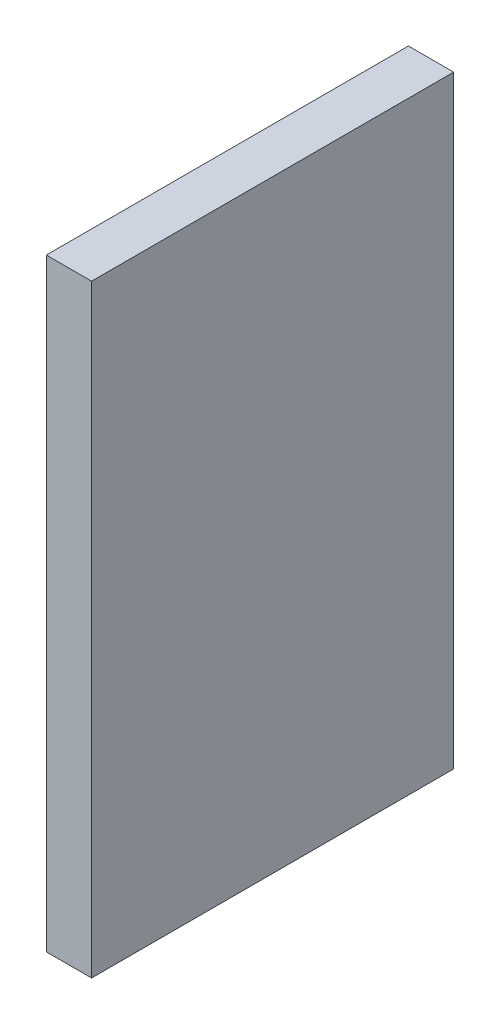
ISO-10303-21;
HEADER;
FILE_DESCRIPTION(('STEP AP214'),'2;1');
FILE_NAME('part.step','',(''),(''),'','','');
FILE_SCHEMA(('AUTOMOTIVE_DESIGN { 1 0 10303 214 1 1 1 1 }'));
ENDSEC;
DATA;
#1=APPLICATION_CONTEXT('core data for automotive mechanical design processes');
#2=APPLICATION_PROTOCOL_DEFINITION('international standard','automotive_design',2000,#1);
#3=PRODUCT_CONTEXT('',#1,'mechanical');
#4=PRODUCT('Part','Part','',(#3));
#5=PRODUCT_RELATED_PRODUCT_CATEGORY('part','',(#4));
#6=PRODUCT_DEFINITION_FORMATION('','',#4);
#7=PRODUCT_DEFINITION_CONTEXT('part definition',#1,'design');
#8=PRODUCT_DEFINITION('design','',#6,#7);
#9=PRODUCT_DEFINITION_SHAPE('','',#8);
#10=(LENGTH_UNIT() NAMED_UNIT(*) SI_UNIT(.MILLI.,.METRE.));
#11=(NAMED_UNIT(*) PLANE_ANGLE_UNIT() SI_UNIT($,.RADIAN.));
#12=(NAMED_UNIT(*) SI_UNIT($,.STERADIAN.) SOLID_ANGLE_UNIT());
#13=UNCERTAINTY_MEASURE_WITH_UNIT(LENGTH_MEASURE(1.E-05),#10,'distance_accuracy_value','');
#14=(GEOMETRIC_REPRESENTATION_CONTEXT(3) GLOBAL_UNCERTAINTY_ASSIGNED_CONTEXT((#13)) GLOBAL_UNIT_ASSIGNED_CONTEXT((#10,
#11,#12)) REPRESENTATION_CONTEXT('',''));
#15=CARTESIAN_POINT('',(0.,0.,0.));
#16=DIRECTION('',(0.,0.,1.));
#17=DIRECTION('',(1.,0.,0.));
#18=AXIS2_PLACEMENT_3D('',#15,#16,#17);
#19=CARTESIAN_POINT('',(15.,100.,-60.));
#20=DIRECTION('',(0.,-1.,0.));
#21=DIRECTION('',(0.,0.,-1.));
#22=AXIS2_PLACEMENT_3D('',#19,#20,#21);
#23=PLANE('',#22);
#24=DIRECTION('',(0.,0.,1.));
#25=VECTOR('',#24,1.);
#26=CARTESIAN_POINT('',(0.,100.,-60.));
#27=LINE('',#26,#25);
#28=CARTESIAN_POINT('',(0.,100.,-60.));
#29=VERTEX_POINT('',#28);
#30=CARTESIAN_POINT('',(0.,100.,60.));
#31=VERTEX_POINT('',#30);
#32=EDGE_CURVE('E102',#29,#31,#27,.T.);
#33=ORIENTED_EDGE('',*,*,#32,.T.);
#34=DIRECTION('',(-1.,0.,0.));
#35=VECTOR('',#34,1.);
#36=CARTESIAN_POINT('',(15.,100.,60.));
#37=LINE('',#36,#35);
#38=CARTESIAN_POINT('',(15.,100.,60.));
#39=VERTEX_POINT('',#38);
#40=EDGE_CURVE('E11',#39,#31,#37,.T.);
#41=ORIENTED_EDGE('',*,*,#40,.F.);
#42=DIRECTION('',(0.,0.,1.));
#43=VECTOR('',#42,1.);
#44=CARTESIAN_POINT('',(15.,100.,-60.));
#45=LINE('',#44,#43);
#46=CARTESIAN_POINT('',(15.,100.,-60.));
#47=VERTEX_POINT('',#46);
#48=EDGE_CURVE('E90',#47,#39,#45,.T.);
#49=ORIENTED_EDGE('',*,*,#48,.F.);
#50=DIRECTION('',(-1.,0.,0.));
#51=VECTOR('',#50,1.);
#52=CARTESIAN_POINT('',(15.,100.,-60.));
#53=LINE('',#52,#51);
#54=EDGE_CURVE('E98',#47,#29,#53,.T.);
#55=ORIENTED_EDGE('',*,*,#54,.T.);
#56=EDGE_LOOP('',(#33,#41,#49,#55));
#57=FACE_BOUND('',#56,.T.);
#58=ADVANCED_FACE('F39',(#57),#23,.F.);
#59=CARTESIAN_POINT('',(15.,-100.,60.));
#60=DIRECTION('',(0.,0.,-1.));
#61=DIRECTION('',(-1.,0.,0.));
#62=AXIS2_PLACEMENT_3D('',#59,#60,#61);
#63=PLANE('',#62);
#64=DIRECTION('',(0.,-1.,0.));
#65=VECTOR('',#64,1.);
#66=CARTESIAN_POINT('',(0.,-100.,60.));
#67=LINE('',#66,#65);
#68=CARTESIAN_POINT('',(0.,-100.,60.));
#69=VERTEX_POINT('',#68);
#70=EDGE_CURVE('E94',#31,#69,#67,.T.);
#71=ORIENTED_EDGE('',*,*,#70,.T.);
#72=DIRECTION('',(-1.,0.,0.));
#73=VECTOR('',#72,1.);
#74=CARTESIAN_POINT('',(15.,-100.,60.));
#75=LINE('',#74,#73);
#76=CARTESIAN_POINT('',(15.,-100.,60.));
#77=VERTEX_POINT('',#76);
#78=EDGE_CURVE('E47',#77,#69,#75,.T.);
#79=ORIENTED_EDGE('',*,*,#78,.F.);
#80=DIRECTION('',(0.,-1.,0.));
#81=VECTOR('',#80,1.);
#82=CARTESIAN_POINT('',(15.,-100.,60.));
#83=LINE('',#82,#81);
#84=EDGE_CURVE('E85',#39,#77,#83,.T.);
#85=ORIENTED_EDGE('',*,*,#84,.F.);
#86=ORIENTED_EDGE('',*,*,#40,.T.);
#87=EDGE_LOOP('',(#71,#79,#85,#86));
#88=FACE_BOUND('',#87,.T.);
#89=ADVANCED_FACE('F93',(#88),#63,.F.);
#90=CARTESIAN_POINT('',(15.,-100.,-60.));
#91=DIRECTION('',(0.,1.,0.));
#92=DIRECTION('',(0.,0.,1.));
#93=AXIS2_PLACEMENT_3D('',#90,#91,#92);
#94=PLANE('',#93);
#95=DIRECTION('',(0.,0.,-1.));
#96=VECTOR('',#95,1.);
#97=CARTESIAN_POINT('',(0.,-100.,-60.));
#98=LINE('',#97,#96);
#99=CARTESIAN_POINT('',(0.,-100.,-60.));
#100=VERTEX_POINT('',#99);
#101=EDGE_CURVE('E72',#69,#100,#98,.T.);
#102=ORIENTED_EDGE('',*,*,#101,.T.);
#103=DIRECTION('',(-1.,0.,0.));
#104=VECTOR('',#103,1.);
#105=CARTESIAN_POINT('',(15.,-100.,-60.));
#106=LINE('',#105,#104);
#107=CARTESIAN_POINT('',(15.,-100.,-60.));
#108=VERTEX_POINT('',#107);
#109=EDGE_CURVE('E95',#108,#100,#106,.T.);
#110=ORIENTED_EDGE('',*,*,#109,.F.);
#111=DIRECTION('',(0.,0.,-1.));
#112=VECTOR('',#111,1.);
#113=CARTESIAN_POINT('',(15.,-100.,-60.));
#114=LINE('',#113,#112);
#115=EDGE_CURVE('E88',#77,#108,#114,.T.);
#116=ORIENTED_EDGE('',*,*,#115,.F.);
#117=ORIENTED_EDGE('',*,*,#78,.T.);
#118=EDGE_LOOP('',(#102,#110,#116,#117));
#119=FACE_BOUND('',#118,.T.);
#120=ADVANCED_FACE('F96',(#119),#94,.F.);
#121=CARTESIAN_POINT('',(15.,-100.,-60.));
#122=DIRECTION('',(0.,0.,1.));
#123=DIRECTION('',(1.,0.,0.));
#124=AXIS2_PLACEMENT_3D('',#121,#122,#123);
#125=PLANE('',#124);
#126=DIRECTION('',(0.,1.,0.));
#127=VECTOR('',#126,1.);
#128=CARTESIAN_POINT('',(0.,-100.,-60.));
#129=LINE('',#128,#127);
#130=EDGE_CURVE('E78',#100,#29,#129,.T.);
#131=ORIENTED_EDGE('',*,*,#130,.T.);
#132=ORIENTED_EDGE('',*,*,#54,.F.);
#133=DIRECTION('',(0.,1.,0.));
#134=VECTOR('',#133,1.);
#135=CARTESIAN_POINT('',(15.,-100.,-60.));
#136=LINE('',#135,#134);
#137=EDGE_CURVE('E55',#108,#47,#136,.T.);
#138=ORIENTED_EDGE('',*,*,#137,.F.);
#139=ORIENTED_EDGE('',*,*,#109,.T.);
#140=EDGE_LOOP('',(#131,#132,#138,#139));
#141=FACE_BOUND('',#140,.T.);
#142=ADVANCED_FACE('F109',(#141),#125,.F.);
#143=CARTESIAN_POINT('',(15.,0.,0.));
#144=DIRECTION('',(-1.,0.,0.));
#145=DIRECTION('',(0.,0.,1.));
#146=AXIS2_PLACEMENT_3D('',#143,#144,#145);
#147=PLANE('',#146);
#148=ORIENTED_EDGE('',*,*,#48,.T.);
#149=ORIENTED_EDGE('',*,*,#84,.T.);
#150=ORIENTED_EDGE('',*,*,#115,.T.);
#151=ORIENTED_EDGE('',*,*,#137,.T.);
#152=EDGE_LOOP('',(#148,#149,#150,#151));
#153=FACE_BOUND('',#152,.T.);
#154=ADVANCED_FACE('F86',(#153),#147,.F.);
#155=CARTESIAN_POINT('',(0.,0.,0.));
#156=DIRECTION('',(-1.,0.,0.));
#157=DIRECTION('',(0.,0.,1.));
#158=AXIS2_PLACEMENT_3D('',#155,#156,#157);
#159=PLANE('',#158);
#160=ORIENTED_EDGE('',*,*,#32,.F.);
#161=ORIENTED_EDGE('',*,*,#130,.F.);
#162=ORIENTED_EDGE('',*,*,#101,.F.);
#163=ORIENTED_EDGE('',*,*,#70,.F.);
#164=EDGE_LOOP('',(#160,#161,#162,#163));
#165=FACE_BOUND('',#164,.T.);
#166=ADVANCED_FACE('F112',(#165),#159,.T.);
#167=CLOSED_SHELL('',(#58,#89,#120,#142,#154,#166));
#168=MANIFOLD_SOLID_BREP('B2',#167);
#169=ADVANCED_BREP_SHAPE_REPRESENTATION('',(#18,#168),#14);
#170=SHAPE_DEFINITION_REPRESENTATION(#9,#169);
ENDSEC;
END-ISO-10303-21;
